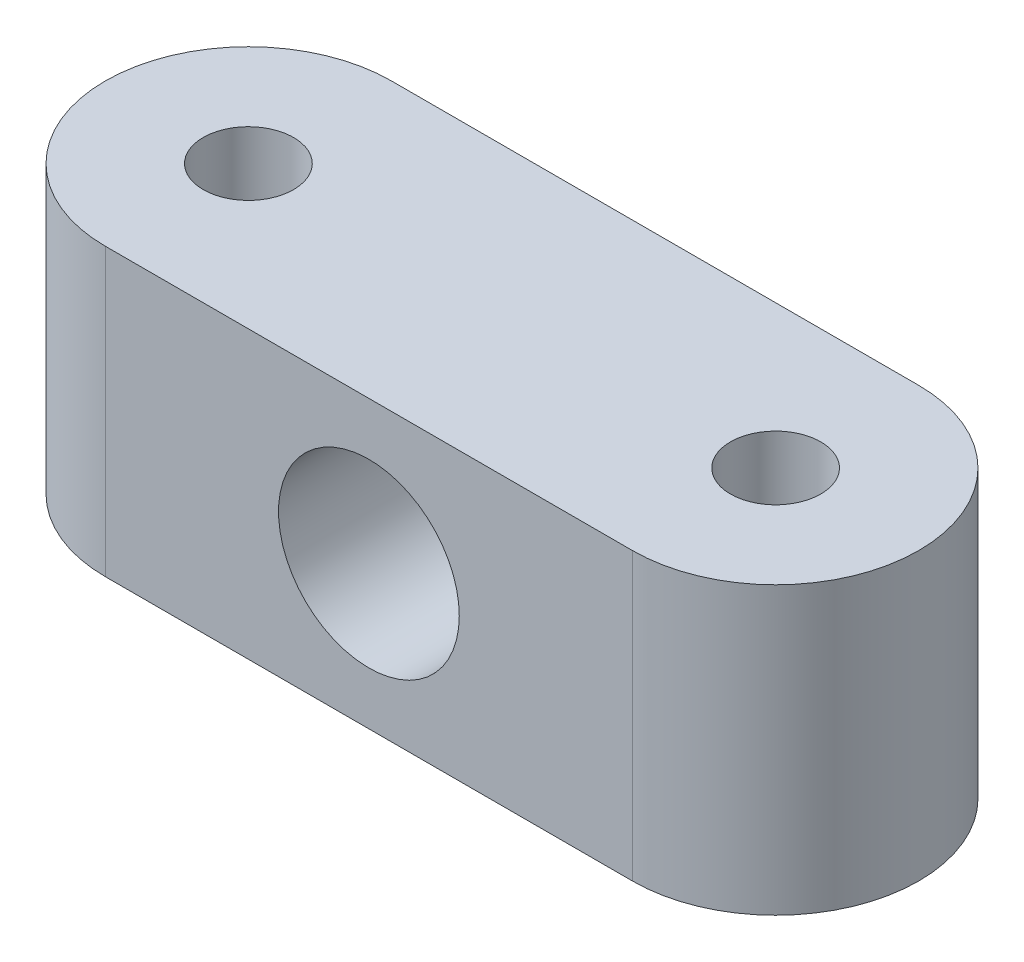
ISO-10303-21;
HEADER;
FILE_DESCRIPTION(('STEP AP214'),'2;1');
FILE_NAME('part.step','',(''),(''),'','','');
FILE_SCHEMA(('AUTOMOTIVE_DESIGN { 1 0 10303 214 1 1 1 1 }'));
ENDSEC;
DATA;
#1=APPLICATION_CONTEXT('core data for automotive mechanical design processes');
#2=APPLICATION_PROTOCOL_DEFINITION('international standard','automotive_design',2000,#1);
#3=PRODUCT_CONTEXT('',#1,'mechanical');
#4=PRODUCT('Part','Part','',(#3));
#5=PRODUCT_RELATED_PRODUCT_CATEGORY('part','',(#4));
#6=PRODUCT_DEFINITION_FORMATION('','',#4);
#7=PRODUCT_DEFINITION_CONTEXT('part definition',#1,'design');
#8=PRODUCT_DEFINITION('design','',#6,#7);
#9=PRODUCT_DEFINITION_SHAPE('','',#8);
#10=(LENGTH_UNIT() NAMED_UNIT(*) SI_UNIT(.MILLI.,.METRE.));
#11=(NAMED_UNIT(*) PLANE_ANGLE_UNIT() SI_UNIT($,.RADIAN.));
#12=(NAMED_UNIT(*) SI_UNIT($,.STERADIAN.) SOLID_ANGLE_UNIT());
#13=UNCERTAINTY_MEASURE_WITH_UNIT(LENGTH_MEASURE(1.E-05),#10,'distance_accuracy_value','');
#14=(GEOMETRIC_REPRESENTATION_CONTEXT(3) GLOBAL_UNCERTAINTY_ASSIGNED_CONTEXT((#13)) GLOBAL_UNIT_ASSIGNED_CONTEXT((#10,
#11,#12)) REPRESENTATION_CONTEXT('',''));
#15=CARTESIAN_POINT('',(0.,0.,0.));
#16=DIRECTION('',(0.,0.,1.));
#17=DIRECTION('',(1.,0.,0.));
#18=AXIS2_PLACEMENT_3D('',#15,#16,#17);
#19=CARTESIAN_POINT('',(0.,38.,0.));
#20=DIRECTION('',(0.,1.,0.));
#21=DIRECTION('',(0.,0.,1.));
#22=AXIS2_PLACEMENT_3D('',#19,#20,#21);
#23=PLANE('',#22);
#24=CARTESIAN_POINT('',(0.,38.,0.));
#25=DIRECTION('',(0.,1.,0.));
#26=DIRECTION('',(0.,0.,1.));
#27=AXIS2_PLACEMENT_3D('',#24,#25,#26);
#28=CIRCLE('',#27,6.);
#29=CARTESIAN_POINT('',(0.,38.,6.));
#30=VERTEX_POINT('',#29);
#31=EDGE_CURVE('E108',#30,#30,#28,.T.);
#32=ORIENTED_EDGE('',*,*,#31,.F.);
#33=EDGE_LOOP('',(#32));
#34=FACE_BOUND('',#33,.T.);
#35=CARTESIAN_POINT('',(0.,38.,0.));
#36=DIRECTION('',(0.,1.,0.));
#37=DIRECTION('',(0.,0.,1.));
#38=AXIS2_PLACEMENT_3D('',#35,#36,#37);
#39=CIRCLE('',#38,19.);
#40=CARTESIAN_POINT('',(0.,38.,-19.));
#41=VERTEX_POINT('',#40);
#42=CARTESIAN_POINT('',(0.,38.,19.));
#43=VERTEX_POINT('',#42);
#44=EDGE_CURVE('E93',#41,#43,#39,.T.);
#45=ORIENTED_EDGE('',*,*,#44,.T.);
#46=DIRECTION('',(1.,0.,0.));
#47=VECTOR('',#46,1.);
#48=CARTESIAN_POINT('',(0.,38.,19.));
#49=LINE('',#48,#47);
#50=CARTESIAN_POINT('',(70.,38.,19.));
#51=VERTEX_POINT('',#50);
#52=EDGE_CURVE('E88',#43,#51,#49,.T.);
#53=ORIENTED_EDGE('',*,*,#52,.T.);
#54=CARTESIAN_POINT('',(70.,38.,0.));
#55=DIRECTION('',(0.,1.,0.));
#56=DIRECTION('',(0.,0.,1.));
#57=AXIS2_PLACEMENT_3D('',#54,#55,#56);
#58=CIRCLE('',#57,19.);
#59=CARTESIAN_POINT('',(70.,38.,-19.));
#60=VERTEX_POINT('',#59);
#61=EDGE_CURVE('E91',#51,#60,#58,.T.);
#62=ORIENTED_EDGE('',*,*,#61,.T.);
#63=DIRECTION('',(-1.,0.,0.));
#64=VECTOR('',#63,1.);
#65=CARTESIAN_POINT('',(0.,38.,-19.));
#66=LINE('',#65,#64);
#67=EDGE_CURVE('E58',#60,#41,#66,.T.);
#68=ORIENTED_EDGE('',*,*,#67,.T.);
#69=EDGE_LOOP('',(#45,#53,#62,#68));
#70=FACE_BOUND('',#69,.T.);
#71=CARTESIAN_POINT('',(70.,38.,0.));
#72=DIRECTION('',(0.,1.,0.));
#73=DIRECTION('',(0.,0.,1.));
#74=AXIS2_PLACEMENT_3D('',#71,#72,#73);
#75=CIRCLE('',#74,6.);
#76=CARTESIAN_POINT('',(70.,38.,6.));
#77=VERTEX_POINT('',#76);
#78=EDGE_CURVE('E123',#77,#77,#75,.T.);
#79=ORIENTED_EDGE('',*,*,#78,.F.);
#80=EDGE_LOOP('',(#79));
#81=FACE_BOUND('',#80,.T.);
#82=ADVANCED_FACE('F41',(#34,#70,#81),#23,.T.);
#83=CARTESIAN_POINT('',(0.,0.,0.));
#84=DIRECTION('',(0.,1.,0.));
#85=DIRECTION('',(0.,0.,1.));
#86=AXIS2_PLACEMENT_3D('',#83,#84,#85);
#87=PLANE('',#86);
#88=CARTESIAN_POINT('',(0.,0.,0.));
#89=DIRECTION('',(0.,1.,0.));
#90=DIRECTION('',(0.,0.,1.));
#91=AXIS2_PLACEMENT_3D('',#88,#89,#90);
#92=CIRCLE('',#91,19.);
#93=CARTESIAN_POINT('',(0.,0.,-19.));
#94=VERTEX_POINT('',#93);
#95=CARTESIAN_POINT('',(0.,0.,19.));
#96=VERTEX_POINT('',#95);
#97=EDGE_CURVE('E105',#94,#96,#92,.T.);
#98=ORIENTED_EDGE('',*,*,#97,.F.);
#99=DIRECTION('',(-1.,0.,0.));
#100=VECTOR('',#99,1.);
#101=CARTESIAN_POINT('',(0.,0.,-19.));
#102=LINE('',#101,#100);
#103=CARTESIAN_POINT('',(70.,0.,-19.));
#104=VERTEX_POINT('',#103);
#105=EDGE_CURVE('E81',#104,#94,#102,.T.);
#106=ORIENTED_EDGE('',*,*,#105,.F.);
#107=CARTESIAN_POINT('',(70.,0.,0.));
#108=DIRECTION('',(0.,1.,0.));
#109=DIRECTION('',(0.,0.,1.));
#110=AXIS2_PLACEMENT_3D('',#107,#108,#109);
#111=CIRCLE('',#110,19.);
#112=CARTESIAN_POINT('',(70.,0.,19.));
#113=VERTEX_POINT('',#112);
#114=EDGE_CURVE('E75',#113,#104,#111,.T.);
#115=ORIENTED_EDGE('',*,*,#114,.F.);
#116=DIRECTION('',(1.,0.,0.));
#117=VECTOR('',#116,1.);
#118=CARTESIAN_POINT('',(0.,0.,19.));
#119=LINE('',#118,#117);
#120=EDGE_CURVE('E97',#96,#113,#119,.T.);
#121=ORIENTED_EDGE('',*,*,#120,.F.);
#122=EDGE_LOOP('',(#98,#106,#115,#121));
#123=FACE_BOUND('',#122,.T.);
#124=CARTESIAN_POINT('',(0.,0.,0.));
#125=DIRECTION('',(0.,1.,0.));
#126=DIRECTION('',(0.,0.,1.));
#127=AXIS2_PLACEMENT_3D('',#124,#125,#126);
#128=CIRCLE('',#127,6.);
#129=CARTESIAN_POINT('',(0.,0.,6.));
#130=VERTEX_POINT('',#129);
#131=EDGE_CURVE('E120',#130,#130,#128,.T.);
#132=ORIENTED_EDGE('',*,*,#131,.T.);
#133=EDGE_LOOP('',(#132));
#134=FACE_BOUND('',#133,.T.);
#135=CARTESIAN_POINT('',(70.,0.,0.));
#136=DIRECTION('',(0.,1.,0.));
#137=DIRECTION('',(0.,0.,1.));
#138=AXIS2_PLACEMENT_3D('',#135,#136,#137);
#139=CIRCLE('',#138,6.);
#140=CARTESIAN_POINT('',(70.,0.,6.));
#141=VERTEX_POINT('',#140);
#142=EDGE_CURVE('E126',#141,#141,#139,.T.);
#143=ORIENTED_EDGE('',*,*,#142,.T.);
#144=EDGE_LOOP('',(#143));
#145=FACE_BOUND('',#144,.T.);
#146=ADVANCED_FACE('F116',(#123,#134,#145),#87,.F.);
#147=CARTESIAN_POINT('',(0.,38.,0.));
#148=DIRECTION('',(0.,-1.,0.));
#149=DIRECTION('',(0.,0.,-1.));
#150=AXIS2_PLACEMENT_3D('',#147,#148,#149);
#151=CYLINDRICAL_SURFACE('',#150,19.);
#152=ORIENTED_EDGE('',*,*,#97,.T.);
#153=DIRECTION('',(0.,-1.,0.));
#154=VECTOR('',#153,1.);
#155=CARTESIAN_POINT('',(0.,38.,19.));
#156=LINE('',#155,#154);
#157=EDGE_CURVE('E11',#43,#96,#156,.T.);
#158=ORIENTED_EDGE('',*,*,#157,.F.);
#159=ORIENTED_EDGE('',*,*,#44,.F.);
#160=DIRECTION('',(0.,-1.,0.));
#161=VECTOR('',#160,1.);
#162=CARTESIAN_POINT('',(0.,38.,-19.));
#163=LINE('',#162,#161);
#164=EDGE_CURVE('E101',#41,#94,#163,.T.);
#165=ORIENTED_EDGE('',*,*,#164,.T.);
#166=EDGE_LOOP('',(#152,#158,#159,#165));
#167=FACE_BOUND('',#166,.T.);
#168=ADVANCED_FACE('F43',(#167),#151,.T.);
#169=CARTESIAN_POINT('',(0.,38.,19.));
#170=DIRECTION('',(0.,0.,-1.));
#171=DIRECTION('',(-1.,0.,0.));
#172=AXIS2_PLACEMENT_3D('',#169,#170,#171);
#173=PLANE('',#172);
#174=CARTESIAN_POINT('',(35.,19.,19.));
#175=DIRECTION('',(0.,0.,1.));
#176=DIRECTION('',(1.,0.,0.));
#177=AXIS2_PLACEMENT_3D('',#174,#175,#176);
#178=CIRCLE('',#177,12.);
#179=CARTESIAN_POINT('',(47.,19.,19.));
#180=VERTEX_POINT('',#179);
#181=EDGE_CURVE('E132',#180,#180,#178,.T.);
#182=ORIENTED_EDGE('',*,*,#181,.F.);
#183=EDGE_LOOP('',(#182));
#184=FACE_BOUND('',#183,.T.);
#185=ORIENTED_EDGE('',*,*,#120,.T.);
#186=DIRECTION('',(0.,-1.,0.));
#187=VECTOR('',#186,1.);
#188=CARTESIAN_POINT('',(70.,38.,19.));
#189=LINE('',#188,#187);
#190=EDGE_CURVE('E50',#51,#113,#189,.T.);
#191=ORIENTED_EDGE('',*,*,#190,.F.);
#192=ORIENTED_EDGE('',*,*,#52,.F.);
#193=ORIENTED_EDGE('',*,*,#157,.T.);
#194=EDGE_LOOP('',(#185,#191,#192,#193));
#195=FACE_BOUND('',#194,.T.);
#196=ADVANCED_FACE('F96',(#184,#195),#173,.F.);
#197=CARTESIAN_POINT('',(70.,38.,0.));
#198=DIRECTION('',(0.,-1.,0.));
#199=DIRECTION('',(0.,0.,-1.));
#200=AXIS2_PLACEMENT_3D('',#197,#198,#199);
#201=CYLINDRICAL_SURFACE('',#200,19.);
#202=ORIENTED_EDGE('',*,*,#114,.T.);
#203=DIRECTION('',(0.,-1.,0.));
#204=VECTOR('',#203,1.);
#205=CARTESIAN_POINT('',(70.,38.,-19.));
#206=LINE('',#205,#204);
#207=EDGE_CURVE('E98',#60,#104,#206,.T.);
#208=ORIENTED_EDGE('',*,*,#207,.F.);
#209=ORIENTED_EDGE('',*,*,#61,.F.);
#210=ORIENTED_EDGE('',*,*,#190,.T.);
#211=EDGE_LOOP('',(#202,#208,#209,#210));
#212=FACE_BOUND('',#211,.T.);
#213=ADVANCED_FACE('F99',(#212),#201,.T.);
#214=CARTESIAN_POINT('',(0.,38.,-19.));
#215=DIRECTION('',(0.,0.,1.));
#216=DIRECTION('',(1.,0.,0.));
#217=AXIS2_PLACEMENT_3D('',#214,#215,#216);
#218=PLANE('',#217);
#219=CARTESIAN_POINT('',(35.,19.,-19.));
#220=DIRECTION('',(0.,0.,1.));
#221=DIRECTION('',(1.,0.,0.));
#222=AXIS2_PLACEMENT_3D('',#219,#220,#221);
#223=CIRCLE('',#222,12.);
#224=CARTESIAN_POINT('',(47.,19.,-19.));
#225=VERTEX_POINT('',#224);
#226=EDGE_CURVE('E129',#225,#225,#223,.T.);
#227=ORIENTED_EDGE('',*,*,#226,.T.);
#228=EDGE_LOOP('',(#227));
#229=FACE_BOUND('',#228,.T.);
#230=ORIENTED_EDGE('',*,*,#105,.T.);
#231=ORIENTED_EDGE('',*,*,#164,.F.);
#232=ORIENTED_EDGE('',*,*,#67,.F.);
#233=ORIENTED_EDGE('',*,*,#207,.T.);
#234=EDGE_LOOP('',(#230,#231,#232,#233));
#235=FACE_BOUND('',#234,.T.);
#236=ADVANCED_FACE('F113',(#229,#235),#218,.F.);
#237=CARTESIAN_POINT('',(0.,38.,0.));
#238=DIRECTION('',(0.,-1.,0.));
#239=DIRECTION('',(0.,0.,-1.));
#240=AXIS2_PLACEMENT_3D('',#237,#238,#239);
#241=CYLINDRICAL_SURFACE('',#240,6.);
#242=ORIENTED_EDGE('',*,*,#31,.T.);
#243=EDGE_LOOP('',(#242));
#244=FACE_BOUND('',#243,.T.);
#245=ORIENTED_EDGE('',*,*,#131,.F.);
#246=EDGE_LOOP('',(#245));
#247=FACE_BOUND('',#246,.T.);
#248=ADVANCED_FACE('F161',(#244,#247),#241,.F.);
#249=CARTESIAN_POINT('',(70.,38.,0.));
#250=DIRECTION('',(0.,-1.,0.));
#251=DIRECTION('',(0.,0.,-1.));
#252=AXIS2_PLACEMENT_3D('',#249,#250,#251);
#253=CYLINDRICAL_SURFACE('',#252,6.);
#254=ORIENTED_EDGE('',*,*,#78,.T.);
#255=EDGE_LOOP('',(#254));
#256=FACE_BOUND('',#255,.T.);
#257=ORIENTED_EDGE('',*,*,#142,.F.);
#258=EDGE_LOOP('',(#257));
#259=FACE_BOUND('',#258,.T.);
#260=ADVANCED_FACE('F142',(#256,#259),#253,.F.);
#261=CARTESIAN_POINT('',(35.,19.,-19.));
#262=DIRECTION('',(0.,0.,1.));
#263=DIRECTION('',(1.,0.,0.));
#264=AXIS2_PLACEMENT_3D('',#261,#262,#263);
#265=CYLINDRICAL_SURFACE('',#264,12.);
#266=ORIENTED_EDGE('',*,*,#226,.F.);
#267=EDGE_LOOP('',(#266));
#268=FACE_BOUND('',#267,.T.);
#269=ORIENTED_EDGE('',*,*,#181,.T.);
#270=EDGE_LOOP('',(#269));
#271=FACE_BOUND('',#270,.T.);
#272=ADVANCED_FACE('F139',(#268,#271),#265,.F.);
#273=CLOSED_SHELL('',(#82,#146,#168,#196,#213,#236,#248,#260,#272));
#274=MANIFOLD_SOLID_BREP('B2',#273);
#275=ADVANCED_BREP_SHAPE_REPRESENTATION('',(#18,#274),#14);
#276=SHAPE_DEFINITION_REPRESENTATION(#9,#275);
ENDSEC;
END-ISO-10303-21;
